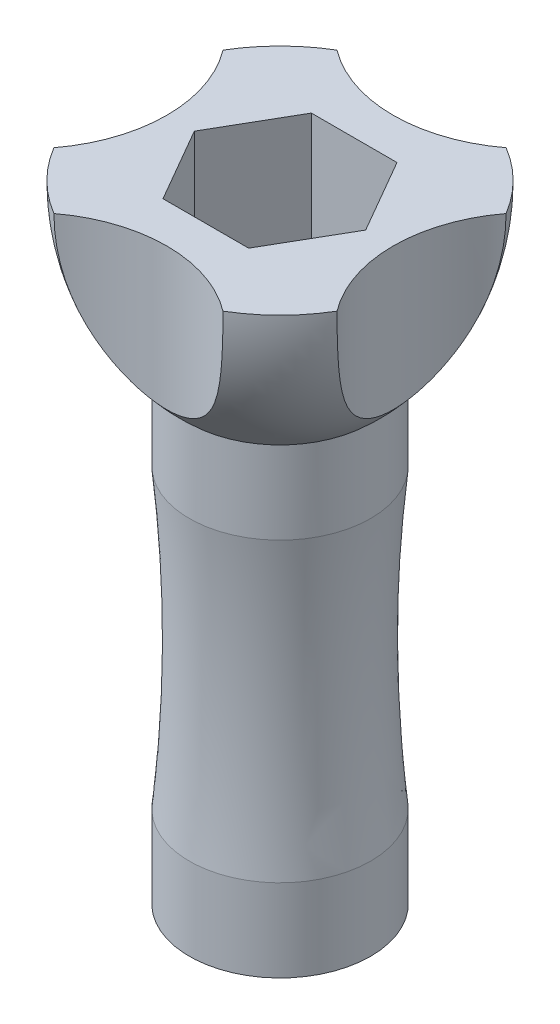
ISO-10303-21;
HEADER;
FILE_DESCRIPTION(('STEP AP214'),'2;1');
FILE_NAME('part.step','',(''),(''),'','','');
FILE_SCHEMA(('AUTOMOTIVE_DESIGN { 1 0 10303 214 1 1 1 1 }'));
ENDSEC;
DATA;
#1=APPLICATION_CONTEXT('core data for automotive mechanical design processes');
#2=APPLICATION_PROTOCOL_DEFINITION('international standard','automotive_design',2000,#1);
#3=PRODUCT_CONTEXT('',#1,'mechanical');
#4=PRODUCT('Part','Part','',(#3));
#5=PRODUCT_RELATED_PRODUCT_CATEGORY('part','',(#4));
#6=PRODUCT_DEFINITION_FORMATION('','',#4);
#7=PRODUCT_DEFINITION_CONTEXT('part definition',#1,'design');
#8=PRODUCT_DEFINITION('design','',#6,#7);
#9=PRODUCT_DEFINITION_SHAPE('','',#8);
#10=(LENGTH_UNIT() NAMED_UNIT(*) SI_UNIT(.MILLI.,.METRE.));
#11=(NAMED_UNIT(*) PLANE_ANGLE_UNIT() SI_UNIT($,.RADIAN.));
#12=(NAMED_UNIT(*) SI_UNIT($,.STERADIAN.) SOLID_ANGLE_UNIT());
#13=UNCERTAINTY_MEASURE_WITH_UNIT(LENGTH_MEASURE(1.E-05),#10,'distance_accuracy_value','');
#14=(GEOMETRIC_REPRESENTATION_CONTEXT(3) GLOBAL_UNCERTAINTY_ASSIGNED_CONTEXT((#13)) GLOBAL_UNIT_ASSIGNED_CONTEXT((#10,
#11,#12)) REPRESENTATION_CONTEXT('',''));
#15=CARTESIAN_POINT('',(0.,0.,0.));
#16=DIRECTION('',(0.,0.,1.));
#17=DIRECTION('',(1.,0.,0.));
#18=AXIS2_PLACEMENT_3D('',#15,#16,#17);
#19=CARTESIAN_POINT('',(0.,81.0055570515781,0.));
#20=DIRECTION('',(0.,1.,0.));
#21=DIRECTION('',(-1.,0.,0.));
#22=AXIS2_PLACEMENT_3D('',#19,#20,#21);
#23=PLANE('',#22);
#24=DIRECTION('',(-1.,0.,0.));
#25=VECTOR('',#24,1.);
#26=CARTESIAN_POINT('',(2.5980762113533,81.0055570515781,-4.50000000000001));
#27=LINE('',#26,#25);
#28=CARTESIAN_POINT('',(2.5980762113533,81.0055570515781,-4.50000000000001));
#29=VERTEX_POINT('',#28);
#30=CARTESIAN_POINT('',(-2.59807621135333,81.0055570515781,-4.49999999999999));
#31=VERTEX_POINT('',#30);
#32=EDGE_CURVE('E53',#29,#31,#27,.T.);
#33=ORIENTED_EDGE('',*,*,#32,.F.);
#34=DIRECTION('',(-0.500000000000004,0.,-0.866025403784436));
#35=VECTOR('',#34,1.);
#36=CARTESIAN_POINT('',(5.19615242270663,81.0055570515781,0.));
#37=LINE('',#36,#35);
#38=CARTESIAN_POINT('',(5.19615242270663,81.0055570515781,0.));
#39=VERTEX_POINT('',#38);
#40=EDGE_CURVE('E135',#39,#29,#37,.T.);
#41=ORIENTED_EDGE('',*,*,#40,.F.);
#42=DIRECTION('',(0.499999999999996,0.,-0.866025403784441));
#43=VECTOR('',#42,1.);
#44=CARTESIAN_POINT('',(2.59807621135333,81.0055570515781,4.49999999999999));
#45=LINE('',#44,#43);
#46=CARTESIAN_POINT('',(2.59807621135333,81.0055570515781,4.49999999999999));
#47=VERTEX_POINT('',#46);
#48=EDGE_CURVE('E138',#47,#39,#45,.T.);
#49=ORIENTED_EDGE('',*,*,#48,.F.);
#50=DIRECTION('',(1.,0.,0.));
#51=VECTOR('',#50,1.);
#52=CARTESIAN_POINT('',(-2.5980762113533,81.0055570515781,4.50000000000001));
#53=LINE('',#52,#51);
#54=CARTESIAN_POINT('',(-2.5980762113533,81.0055570515781,4.50000000000001));
#55=VERTEX_POINT('',#54);
#56=EDGE_CURVE('E157',#55,#47,#53,.T.);
#57=ORIENTED_EDGE('',*,*,#56,.F.);
#58=DIRECTION('',(0.500000000000004,0.,0.866025403784436));
#59=VECTOR('',#58,1.);
#60=CARTESIAN_POINT('',(-5.19615242270663,81.0055570515781,0.));
#61=LINE('',#60,#59);
#62=CARTESIAN_POINT('',(-5.19615242270663,81.0055570515781,0.));
#63=VERTEX_POINT('',#62);
#64=EDGE_CURVE('E154',#63,#55,#61,.T.);
#65=ORIENTED_EDGE('',*,*,#64,.F.);
#66=DIRECTION('',(-0.499999999999996,0.,0.866025403784441));
#67=VECTOR('',#66,1.);
#68=CARTESIAN_POINT('',(-2.59807621135334,81.0055570515781,-4.49999999999999));
#69=LINE('',#68,#67);
#70=EDGE_CURVE('E152',#31,#63,#69,.T.);
#71=ORIENTED_EDGE('',*,*,#70,.F.);
#72=EDGE_LOOP('',(#33,#41,#49,#57,#65,#71));
#73=FACE_BOUND('',#72,.T.);
#74=CARTESIAN_POINT('',(15.3642734399295,81.0055570515781,-1.60932222001191E-13));
#75=DIRECTION('',(0.,1.,0.));
#76=DIRECTION('',(0.,0.,-1.));
#77=AXIS2_PLACEMENT_3D('',#74,#75,#76);
#78=CIRCLE('',#77,8.5);
#79=CARTESIAN_POINT('',(8.58520578172331,81.0055570515781,-5.12779111172292));
#80=VERTEX_POINT('',#79);
#81=CARTESIAN_POINT('',(8.58520578172342,81.0055570515781,5.12779111172274));
#82=VERTEX_POINT('',#81);
#83=EDGE_CURVE('E59',#80,#82,#78,.T.);
#84=ORIENTED_EDGE('',*,*,#83,.F.);
#85=CARTESIAN_POINT('',(0.,81.0055570515781,0.));
#86=DIRECTION('',(0.,1.,0.));
#87=DIRECTION('',(-1.,0.,0.));
#88=AXIS2_PLACEMENT_3D('',#85,#86,#87);
#89=CIRCLE('',#88,10.);
#90=CARTESIAN_POINT('',(5.12779111172283,81.0055570515781,-8.58520578172337));
#91=VERTEX_POINT('',#90);
#92=EDGE_CURVE('E259',#80,#91,#89,.T.);
#93=ORIENTED_EDGE('',*,*,#92,.T.);
#94=CARTESIAN_POINT('',(0.,81.0055570515781,-15.3642734399295));
#95=DIRECTION('',(0.,1.,0.));
#96=DIRECTION('',(-1.,0.,0.));
#97=AXIS2_PLACEMENT_3D('',#94,#95,#96);
#98=CIRCLE('',#97,8.5);
#99=CARTESIAN_POINT('',(-5.12779111172283,81.0055570515781,-8.58520578172337));
#100=VERTEX_POINT('',#99);
#101=EDGE_CURVE('E176',#100,#91,#98,.T.);
#102=ORIENTED_EDGE('',*,*,#101,.F.);
#103=CARTESIAN_POINT('',(-8.58520578172339,81.0055570515781,-5.1277911117228));
#104=VERTEX_POINT('',#103);
#105=EDGE_CURVE('E267',#100,#104,#89,.T.);
#106=ORIENTED_EDGE('',*,*,#105,.T.);
#107=CARTESIAN_POINT('',(-15.3642734399295,81.0055570515781,0.));
#108=DIRECTION('',(0.,1.,0.));
#109=DIRECTION('',(0.,0.,1.));
#110=AXIS2_PLACEMENT_3D('',#107,#108,#109);
#111=CIRCLE('',#110,8.5);
#112=CARTESIAN_POINT('',(-8.58520578172335,81.0055570515781,5.12779111172286));
#113=VERTEX_POINT('',#112);
#114=EDGE_CURVE('E174',#113,#104,#111,.T.);
#115=ORIENTED_EDGE('',*,*,#114,.F.);
#116=CARTESIAN_POINT('',(-5.12779111172283,81.0055570515781,8.58520578172337));
#117=VERTEX_POINT('',#116);
#118=EDGE_CURVE('E268',#113,#117,#89,.T.);
#119=ORIENTED_EDGE('',*,*,#118,.T.);
#120=CARTESIAN_POINT('',(0.,81.0055570515781,15.3642734399295));
#121=DIRECTION('',(0.,1.,0.));
#122=DIRECTION('',(1.,0.,0.));
#123=AXIS2_PLACEMENT_3D('',#120,#121,#122);
#124=CIRCLE('',#123,8.5);
#125=CARTESIAN_POINT('',(5.12779111172283,81.0055570515781,8.58520578172337));
#126=VERTEX_POINT('',#125);
#127=EDGE_CURVE('E172',#126,#117,#124,.T.);
#128=ORIENTED_EDGE('',*,*,#127,.F.);
#129=EDGE_CURVE('E262',#126,#82,#89,.T.);
#130=ORIENTED_EDGE('',*,*,#129,.T.);
#131=EDGE_LOOP('',(#84,#93,#102,#106,#115,#119,#128,#130));
#132=FACE_BOUND('',#131,.T.);
#133=ADVANCED_FACE('F34',(#73,#132),#23,.T.);
#134=CARTESIAN_POINT('',(0.,81.0055570515781,0.));
#135=DIRECTION('',(0.,1.,0.));
#136=DIRECTION('',(-1.,0.,0.));
#137=AXIS2_PLACEMENT_3D('',#134,#135,#136);
#138=DEGENERATE_TOROIDAL_SURFACE('',#137,3.36111111111111,13.3611111111111,.F.);
#139=CARTESIAN_POINT('',(8.58520578074916,81.0057570515781,5.12779111043474));
#140=CARTESIAN_POINT('',(8.58521510235949,80.8258874002957,5.1277844100921));
#141=CARTESIAN_POINT('',(8.58284540719682,80.6460181022198,5.12467012819343));
#142=CARTESIAN_POINT('',(8.57340323176649,80.2866124661946,5.1121614356591));
#143=CARTESIAN_POINT('',(8.5663305058715,80.1070761461271,5.10276669701104));
#144=CARTESIAN_POINT('',(8.54752250671016,79.7484011192916,5.07761202233893));
#145=CARTESIAN_POINT('',(8.53577979792645,79.5692635069664,5.06184193485922));
#146=CARTESIAN_POINT('',(8.50775011829168,79.2120524184934,5.02380681499541));
#147=CARTESIAN_POINT('',(8.49146322599246,79.0339789240054,5.00154189488221));
#148=CARTESIAN_POINT('',(8.43562888599376,78.4983060877408,4.92423248457801));
#149=CARTESIAN_POINT('',(8.38929798991118,78.1428107469501,4.85891400251113));
#150=CARTESIAN_POINT('',(8.2805822745697,77.4412363668623,4.6990090435988));
#151=CARTESIAN_POINT('',(8.21821190013479,77.0951491632736,4.60444888576899));
#152=CARTESIAN_POINT('',(8.10774916456528,76.5515205756915,4.42706932263151));
#153=CARTESIAN_POINT('',(8.06386403265072,76.3497160336694,4.35457405601448));
#154=CARTESIAN_POINT('',(7.97212280976563,75.9519847065445,4.19695677456097));
#155=CARTESIAN_POINT('',(7.92426670841742,75.7560579368044,4.11183472672536));
#156=CARTESIAN_POINT('',(7.82572248150285,75.3720628144471,3.92824049763953));
#157=CARTESIAN_POINT('',(7.77504383841834,75.183971468735,3.82981159828957));
#158=CARTESIAN_POINT('',(7.6719473718007,74.8168002845552,3.61827918614909));
#159=CARTESIAN_POINT('',(7.61953021370208,74.6377170627054,3.50518124092443));
#160=CARTESIAN_POINT('',(7.49643791079024,74.2313832891448,3.22159201431549));
#161=CARTESIAN_POINT('',(7.42563809388911,74.0085577916968,3.04468773087888));
#162=CARTESIAN_POINT('',(7.28824337924347,73.5908227026285,2.6588631061338));
#163=CARTESIAN_POINT('',(7.22164325771497,73.3958780326295,2.44998369223612));
#164=CARTESIAN_POINT('',(7.11596840906974,73.0938083902993,2.06016067067646));
#165=CARTESIAN_POINT('',(7.07435387075474,72.9772608889479,1.88726448434432));
#166=CARTESIAN_POINT('',(6.9999833051339,72.7715021565778,1.52408416151124));
#167=CARTESIAN_POINT('',(6.96721420030134,72.6822505436937,1.33382625691851));
#168=CARTESIAN_POINT('',(6.91850029073493,72.5504922875337,0.972720969629719));
#169=CARTESIAN_POINT('',(6.90063704068949,72.5026029520231,0.804115212035829));
#170=CARTESIAN_POINT('',(6.87502650710229,72.4341124908896,0.460695784841164));
#171=CARTESIAN_POINT('',(6.86727136946848,72.4134901783706,0.285887043639818));
#172=CARTESIAN_POINT('',(6.86270679152793,72.4013401617101,-0.0652932285348966));
#173=CARTESIAN_POINT('',(6.86592182398371,72.4098775083263,-0.241667377026025));
#174=CARTESIAN_POINT('',(6.882989166515,72.4553948650794,-0.590177026018225));
#175=CARTESIAN_POINT('',(6.89684672333955,72.4923889043387,-0.762310392607131));
#176=CARTESIAN_POINT('',(6.93337816584581,72.5906550057985,-1.09422530084855));
#177=CARTESIAN_POINT('',(6.95585308928579,72.6513797296783,-1.25419440047924));
#178=CARTESIAN_POINT('',(7.00782516932235,72.7932727194891,-1.56346067972205));
#179=CARTESIAN_POINT('',(7.03732527370789,72.8744495680297,-1.71275334518184));
#180=CARTESIAN_POINT('',(7.12133934515685,73.1087888323686,-2.08820154643023));
#181=CARTESIAN_POINT('',(7.18005934266116,73.275470243877,-2.30497420051247));
#182=CARTESIAN_POINT('',(7.30452558876643,73.6399415271167,-2.70837812142575));
#183=CARTESIAN_POINT('',(7.37029123711913,73.8378180366124,-2.89492241882454));
#184=CARTESIAN_POINT('',(7.48871434324869,74.2085132791403,-3.20093343169055));
#185=CARTESIAN_POINT('',(7.5409775887762,74.3768975623972,-3.32603421391277));
#186=CARTESIAN_POINT('',(7.64500494455999,74.724328644567,-3.56081510640736));
#187=CARTESIAN_POINT('',(7.69676876976349,74.903381157415,-3.67048684520418));
#188=CARTESIAN_POINT('',(7.79843313018467,75.2702114230251,-3.87571754713384));
#189=CARTESIAN_POINT('',(7.84833083575132,75.4580015285221,-3.97125567966265));
#190=CARTESIAN_POINT('',(7.94506417028657,75.8405014067315,-4.14916539930637));
#191=CARTESIAN_POINT('',(7.9918989360158,76.0352131065192,-4.23153328397305));
#192=CARTESIAN_POINT('',(8.10168008897518,76.5188980093283,-4.41828367024131));
#193=CARTESIAN_POINT('',(8.16242880622171,76.8109720652385,-4.51596560718152));
#194=CARTESIAN_POINT('',(8.27330577723037,77.40391361987,-4.68813764283413));
#195=CARTESIAN_POINT('',(8.32342853420672,77.7047855786005,-4.76261574756427));
#196=CARTESIAN_POINT('',(8.41137002805972,78.3125375746025,-4.89010449255737));
#197=CARTESIAN_POINT('',(8.44919808240863,78.6194128743999,-4.9431313969854));
#198=CARTESIAN_POINT('',(8.51144511389522,79.2371491092861,-5.02907137675292));
#199=CARTESIAN_POINT('',(8.53587119701079,79.5480078426291,-5.0619951122189));
#200=CARTESIAN_POINT('',(8.56388642153772,80.0505883227128,-5.09951324246309));
#201=CARTESIAN_POINT('',(8.57188448344948,80.2416462656977,-5.11014500176714));
#202=CARTESIAN_POINT('',(8.58254259390755,80.6237169747329,-5.12427104569803));
#203=CARTESIAN_POINT('',(8.58521535903792,80.8147287566903,-5.12778233406707));
#204=CARTESIAN_POINT('',(8.58520578074905,81.0057570515781,-5.12779111043492));
#205=B_SPLINE_CURVE_WITH_KNOTS('',3,(#139,#140,#141,#142,#143,#144,#145,#146,#147,#148,#149,
#150,#151,#152,#153,#154,#155,#156,#157,#158,#159,#160,#161,#162,#163,#164,#165,#166,#167,#168,
#169,#170,#171,#172,#173,#174,#175,#176,#177,#178,#179,#180,#181,#182,#183,#184,#185,#186,#187,
#188,#189,#190,#191,#192,#193,#194,#195,#196,#197,#198,#199,#200,#201,#202,#203,#204),
.UNSPECIFIED.,.F.,.F.,(4,2,2,2,2,2,2,2,2,2,2,2,2,2,2,2,2,2,2,2,2,2,2,2,2,2,2,2,2,2,2,2,4),(0.,
0.53956500657715,1.07915819547398,1.61961398311804,2.16006042889451,3.2516230957294,
4.34220614540108,4.9984239672419,5.65464350408923,6.30877778922379,6.96266452340408,
7.83975749839001,8.71573706001084,9.35149585268555,9.9863094949294,10.5126048696457,
11.0384910639751,11.5655511958403,12.0928713345148,12.6086857848282,13.1247170551278,
13.9590107504667,14.7956637201667,15.4433531594585,16.0913926771979,16.7403779813031,
17.3895454099902,18.3299349430704,19.2708097569301,20.210969862351,21.1506309942418,
21.7250042627116,22.2980043002763),.UNSPECIFIED.);
#206=EDGE_CURVE('E11',#82,#80,#205,.T.);
#207=ORIENTED_EDGE('',*,*,#206,.F.);
#208=ORIENTED_EDGE('',*,*,#129,.F.);
#209=CARTESIAN_POINT('',(-5.12779111043483,81.0057570515781,8.58520578074911));
#210=CARTESIAN_POINT('',(-5.12778441009219,80.8258874002957,8.58521510235944));
#211=CARTESIAN_POINT('',(-5.12467012819352,80.6460181022198,8.58284540719677));
#212=CARTESIAN_POINT('',(-5.11216143565919,80.2866124661946,8.57340323176644));
#213=CARTESIAN_POINT('',(-5.10276669701113,80.1070761461271,8.56633050587145));
#214=CARTESIAN_POINT('',(-5.07761202233902,79.7484011192916,8.54752250671011));
#215=CARTESIAN_POINT('',(-5.06184193485931,79.5692635069664,8.53577979792639));
#216=CARTESIAN_POINT('',(-5.0238068149955,79.2120524184934,8.50775011829163));
#217=CARTESIAN_POINT('',(-5.0015418948823,79.0339789240054,8.49146322599241));
#218=CARTESIAN_POINT('',(-4.92423248457809,78.4983060877408,8.43562888599371));
#219=CARTESIAN_POINT('',(-4.85891400251122,78.1428107469501,8.38929798991112));
#220=CARTESIAN_POINT('',(-4.69900904359889,77.4412363668623,8.28058227456965));
#221=CARTESIAN_POINT('',(-4.60444888576907,77.0951491632736,8.21821190013474));
#222=CARTESIAN_POINT('',(-4.4270693226316,76.5515205756915,8.10774916456523));
#223=CARTESIAN_POINT('',(-4.35457405601456,76.3497160336694,8.06386403265067));
#224=CARTESIAN_POINT('',(-4.19695677456106,75.9519847065445,7.97212280976559));
#225=CARTESIAN_POINT('',(-4.11183472672544,75.7560579368044,7.92426670841738));
#226=CARTESIAN_POINT('',(-3.92824049763962,75.3720628144471,7.82572248150281));
#227=CARTESIAN_POINT('',(-3.82981159828966,75.183971468735,7.7750438384183));
#228=CARTESIAN_POINT('',(-3.61827918614919,74.8168002845552,7.67194737180067));
#229=CARTESIAN_POINT('',(-3.50518124092452,74.6377170627054,7.61953021370205));
#230=CARTESIAN_POINT('',(-3.22159201431558,74.2313832891448,7.49643791079021));
#231=CARTESIAN_POINT('',(-3.04468773087896,74.0085577916968,7.42563809388908));
#232=CARTESIAN_POINT('',(-2.65886310613388,73.5908227026285,7.28824337924344));
#233=CARTESIAN_POINT('',(-2.4499836922362,73.3958780326295,7.22164325771495));
#234=CARTESIAN_POINT('',(-2.06016067067654,73.0938083902993,7.11596840906972));
#235=CARTESIAN_POINT('',(-1.8872644843444,72.9772608889479,7.07435387075472));
#236=CARTESIAN_POINT('',(-1.52408416151133,72.7715021565778,6.99998330513389));
#237=CARTESIAN_POINT('',(-1.3338262569186,72.6822505436937,6.96721420030132));
#238=CARTESIAN_POINT('',(-0.972720969629809,72.5504922875337,6.91850029073492));
#239=CARTESIAN_POINT('',(-0.804115212035921,72.5026029520231,6.90063704068949));
#240=CARTESIAN_POINT('',(-0.460695784841255,72.4341124908896,6.87502650710228));
#241=CARTESIAN_POINT('',(-0.285887043639906,72.4134901783706,6.86727136946847));
#242=CARTESIAN_POINT('',(0.0652932285348104,72.4013401617101,6.86270679152793));
#243=CARTESIAN_POINT('',(0.241667377025939,72.4098775083263,6.86592182398372));
#244=CARTESIAN_POINT('',(0.59017702601814,72.4553948650794,6.88298916651501));
#245=CARTESIAN_POINT('',(0.762310392607046,72.4923889043387,6.89684672333955));
#246=CARTESIAN_POINT('',(1.09422530084847,72.5906550057985,6.93337816584582));
#247=CARTESIAN_POINT('',(1.25419440047916,72.6513797296783,6.9558530892858));
#248=CARTESIAN_POINT('',(1.56346067972197,72.7932727194891,7.00782516932236));
#249=CARTESIAN_POINT('',(1.71275334518176,72.8744495680297,7.03732527370791));
#250=CARTESIAN_POINT('',(2.08820154643015,73.1087888323686,7.12133934515687));
#251=CARTESIAN_POINT('',(2.30497420051238,73.275470243877,7.18005934266118));
#252=CARTESIAN_POINT('',(2.70837812142566,73.6399415271167,7.30452558876645));
#253=CARTESIAN_POINT('',(2.89492241882445,73.8378180366124,7.37029123711915));
#254=CARTESIAN_POINT('',(3.20093343169046,74.2085132791402,7.48871434324872));
#255=CARTESIAN_POINT('',(3.32603421391268,74.3768975623972,7.54097758877623));
#256=CARTESIAN_POINT('',(3.56081510640727,74.724328644567,7.64500494456002));
#257=CARTESIAN_POINT('',(3.67048684520409,74.903381157415,7.69676876976352));
#258=CARTESIAN_POINT('',(3.87571754713375,75.2702114230251,7.79843313018471));
#259=CARTESIAN_POINT('',(3.97125567966256,75.4580015285221,7.84833083575136));
#260=CARTESIAN_POINT('',(4.14916539930628,75.8405014067314,7.94506417028661));
#261=CARTESIAN_POINT('',(4.23153328397295,76.0352131065192,7.99189893601584));
#262=CARTESIAN_POINT('',(4.41828367024122,76.5188980093283,8.10168008897522));
#263=CARTESIAN_POINT('',(4.51596560718143,76.8109720652385,8.16242880622175));
#264=CARTESIAN_POINT('',(4.68813764283403,77.4039136198699,8.27330577723042));
#265=CARTESIAN_POINT('',(4.76261574756417,77.7047855786004,8.32342853420676));
#266=CARTESIAN_POINT('',(4.89010449255727,78.3125375746024,8.41137002805977));
#267=CARTESIAN_POINT('',(4.9431313969853,78.6194128743998,8.44919808240867));
#268=CARTESIAN_POINT('',(5.02907137675283,79.2371491092861,8.51144511389527));
#269=CARTESIAN_POINT('',(5.0619951122188,79.5480078426291,8.53587119701084));
#270=CARTESIAN_POINT('',(5.099513242463,80.0505883227128,8.56388642153777));
#271=CARTESIAN_POINT('',(5.11014500176704,80.2416462656977,8.57188448344953));
#272=CARTESIAN_POINT('',(5.12427104569794,80.6237169747329,8.5825425939076));
#273=CARTESIAN_POINT('',(5.12778233406698,80.8147287566903,8.58521535903797));
#274=CARTESIAN_POINT('',(5.12779111043483,81.0057570515781,8.5852057807491));
#275=B_SPLINE_CURVE_WITH_KNOTS('',3,(#209,#210,#211,#212,#213,#214,#215,#216,#217,#218,#219,
#220,#221,#222,#223,#224,#225,#226,#227,#228,#229,#230,#231,#232,#233,#234,#235,#236,#237,#238,
#239,#240,#241,#242,#243,#244,#245,#246,#247,#248,#249,#250,#251,#252,#253,#254,#255,#256,#257,
#258,#259,#260,#261,#262,#263,#264,#265,#266,#267,#268,#269,#270,#271,#272,#273,#274),
.UNSPECIFIED.,.F.,.F.,(4,2,2,2,2,2,2,2,2,2,2,2,2,2,2,2,2,2,2,2,2,2,2,2,2,2,2,2,2,2,2,2,4),(0.,
0.53956500657715,1.07915819547398,1.61961398311804,2.16006042889451,3.25162309572941,
4.34220614540108,4.9984239672419,5.65464350408923,6.30877778922376,6.96266452340406,
7.83975749838999,8.71573706001082,9.35149585268553,9.98630949492938,10.5126048696457,
11.038491063975,11.5655511958402,12.0928713345147,12.6086857848282,13.1247170551278,
13.9590107504666,14.7956637201667,15.4433531594584,16.0913926771978,16.7403779813031,
17.3895454099902,18.3299349430704,19.27080975693,20.2109698623509,21.1506309942417,
21.7250042627116,22.2980043002763),.UNSPECIFIED.);
#276=EDGE_CURVE('E46',#117,#126,#275,.T.);
#277=ORIENTED_EDGE('',*,*,#276,.F.);
#278=ORIENTED_EDGE('',*,*,#118,.F.);
#279=CARTESIAN_POINT('',(-8.58520578074912,81.0057570515781,-5.1277911104348));
#280=CARTESIAN_POINT('',(-8.58521510235945,80.8258874002957,-5.12778441009216));
#281=CARTESIAN_POINT('',(-8.58284540719679,80.6460181022198,-5.12467012819349));
#282=CARTESIAN_POINT('',(-8.57340323176645,80.2866124661946,-5.11216143565916));
#283=CARTESIAN_POINT('',(-8.56633050587147,80.1070761461271,-5.1027666970111));
#284=CARTESIAN_POINT('',(-8.54752250671013,79.7484011192916,-5.07761202233899));
#285=CARTESIAN_POINT('',(-8.53577979792641,79.5692635069664,-5.06184193485928));
#286=CARTESIAN_POINT('',(-8.50775011829165,79.2120524184934,-5.02380681499547));
#287=CARTESIAN_POINT('',(-8.49146322599243,79.0339789240054,-5.00154189488228));
#288=CARTESIAN_POINT('',(-8.43562888599372,78.4983060877408,-4.92423248457806));
#289=CARTESIAN_POINT('',(-8.38929798991114,78.1428107469501,-4.85891400251119));
#290=CARTESIAN_POINT('',(-8.28058227456967,77.4412363668623,-4.69900904359886));
#291=CARTESIAN_POINT('',(-8.21821190013475,77.0951491632736,-4.60444888576905));
#292=CARTESIAN_POINT('',(-8.10774916456525,76.5515205756915,-4.42706932263157));
#293=CARTESIAN_POINT('',(-8.06386403265069,76.3497160336694,-4.35457405601453));
#294=CARTESIAN_POINT('',(-7.97212280976561,75.9519847065445,-4.19695677456103));
#295=CARTESIAN_POINT('',(-7.92426670841739,75.7560579368044,-4.11183472672541));
#296=CARTESIAN_POINT('',(-7.82572248150282,75.3720628144471,-3.92824049763959));
#297=CARTESIAN_POINT('',(-7.77504383841831,75.183971468735,-3.82981159828963));
#298=CARTESIAN_POINT('',(-7.67194737180068,74.8168002845552,-3.61827918614916));
#299=CARTESIAN_POINT('',(-7.61953021370206,74.6377170627054,-3.50518124092449));
#300=CARTESIAN_POINT('',(-7.49643791079022,74.2313832891448,-3.22159201431555));
#301=CARTESIAN_POINT('',(-7.42563809388909,74.0085577916968,-3.04468773087894));
#302=CARTESIAN_POINT('',(-7.28824337924345,73.5908227026285,-2.65886310613385));
#303=CARTESIAN_POINT('',(-7.22164325771496,73.3958780326295,-2.44998369223617));
#304=CARTESIAN_POINT('',(-7.11596840906973,73.0938083902993,-2.06016067067652));
#305=CARTESIAN_POINT('',(-7.07435387075473,72.9772608889479,-1.88726448434438));
#306=CARTESIAN_POINT('',(-6.99998330513389,72.7715021565778,-1.5240841615113));
#307=CARTESIAN_POINT('',(-6.96721420030133,72.6822505436937,-1.33382625691858));
#308=CARTESIAN_POINT('',(-6.91850029073492,72.5504922875337,-0.972720969629784));
#309=CARTESIAN_POINT('',(-6.90063704068949,72.5026029520231,-0.804115212035896));
#310=CARTESIAN_POINT('',(-6.87502650710228,72.4341124908896,-0.46069578484123));
#311=CARTESIAN_POINT('',(-6.86727136946848,72.4134901783706,-0.285887043639881));
#312=CARTESIAN_POINT('',(-6.86270679152793,72.4013401617101,0.0652932285348364));
#313=CARTESIAN_POINT('',(-6.86592182398372,72.4098775083263,0.241667377025965));
#314=CARTESIAN_POINT('',(-6.88298916651501,72.4553948650794,0.590177026018167));
#315=CARTESIAN_POINT('',(-6.89684672333955,72.4923889043387,0.762310392607074));
#316=CARTESIAN_POINT('',(-6.93337816584581,72.5906550057985,1.0942253008485));
#317=CARTESIAN_POINT('',(-6.9558530892858,72.6513797296783,1.25419440047919));
#318=CARTESIAN_POINT('',(-7.00782516932236,72.7932727194891,1.563460679722));
#319=CARTESIAN_POINT('',(-7.0373252737079,72.8744495680297,1.71275334518178));
#320=CARTESIAN_POINT('',(-7.12133934515686,73.1087888323686,2.08820154643018));
#321=CARTESIAN_POINT('',(-7.18005934266117,73.275470243877,2.30497420051241));
#322=CARTESIAN_POINT('',(-7.30452558876644,73.6399415271167,2.70837812142569));
#323=CARTESIAN_POINT('',(-7.37029123711914,73.8378180366124,2.89492241882448));
#324=CARTESIAN_POINT('',(-7.48871434324871,74.2085132791403,3.20093343169049));
#325=CARTESIAN_POINT('',(-7.54097758877622,74.3768975623972,3.32603421391272));
#326=CARTESIAN_POINT('',(-7.64500494456002,74.724328644567,3.56081510640731));
#327=CARTESIAN_POINT('',(-7.69676876976351,74.903381157415,3.67048684520413));
#328=CARTESIAN_POINT('',(-7.7984331301847,75.2702114230251,3.87571754713378));
#329=CARTESIAN_POINT('',(-7.84833083575135,75.4580015285221,3.9712556796626));
#330=CARTESIAN_POINT('',(-7.9450641702866,75.8405014067315,4.14916539930632));
#331=CARTESIAN_POINT('',(-7.99189893601583,76.0352131065192,4.23153328397299));
#332=CARTESIAN_POINT('',(-8.10168008897521,76.5188980093283,4.41828367024125));
#333=CARTESIAN_POINT('',(-8.16242880622174,76.8109720652385,4.51596560718146));
#334=CARTESIAN_POINT('',(-8.27330577723041,77.40391361987,4.68813764283406));
#335=CARTESIAN_POINT('',(-8.32342853420675,77.7047855786005,4.76261574756421));
#336=CARTESIAN_POINT('',(-8.41137002805976,78.3125375746025,4.89010449255731));
#337=CARTESIAN_POINT('',(-8.44919808240866,78.6194128743998,4.94313139698534));
#338=CARTESIAN_POINT('',(-8.51144511389525,79.2371491092861,5.02907137675286));
#339=CARTESIAN_POINT('',(-8.53587119701082,79.5480078426291,5.06199511221884));
#340=CARTESIAN_POINT('',(-8.56388642153775,80.0505883227128,5.09951324246303));
#341=CARTESIAN_POINT('',(-8.57188448344951,80.2416462656977,5.11014500176708));
#342=CARTESIAN_POINT('',(-8.58254259390758,80.6237169747329,5.12427104569797));
#343=CARTESIAN_POINT('',(-8.58521535903795,80.8147287566903,5.12778233406701));
#344=CARTESIAN_POINT('',(-8.58520578074909,81.0057570515781,5.12779111043486));
#345=B_SPLINE_CURVE_WITH_KNOTS('',3,(#279,#280,#281,#282,#283,#284,#285,#286,#287,#288,#289,
#290,#291,#292,#293,#294,#295,#296,#297,#298,#299,#300,#301,#302,#303,#304,#305,#306,#307,#308,
#309,#310,#311,#312,#313,#314,#315,#316,#317,#318,#319,#320,#321,#322,#323,#324,#325,#326,#327,
#328,#329,#330,#331,#332,#333,#334,#335,#336,#337,#338,#339,#340,#341,#342,#343,#344),
.UNSPECIFIED.,.F.,.F.,(4,2,2,2,2,2,2,2,2,2,2,2,2,2,2,2,2,2,2,2,2,2,2,2,2,2,2,2,2,2,2,2,4),(0.,
0.53956500657715,1.07915819547398,1.61961398311804,2.16006042889451,3.2516230957294,
4.34220614540108,4.9984239672419,5.65464350408923,6.30877778922376,6.96266452340406,
7.83975749838999,8.71573706001083,9.35149585268553,9.98630949492938,10.5126048696457,
11.038491063975,11.5655511958402,12.0928713345148,12.6086857848282,13.1247170551278,
13.9590107504666,14.7956637201667,15.4433531594585,16.0913926771979,16.7403779813031,
17.3895454099902,18.3299349430704,19.2708097569301,20.2109698623509,21.1506309942417,
21.7250042627116,22.2980043002763),.UNSPECIFIED.);
#346=EDGE_CURVE('E215',#104,#113,#345,.T.);
#347=ORIENTED_EDGE('',*,*,#346,.F.);
#348=ORIENTED_EDGE('',*,*,#105,.F.);
#349=CARTESIAN_POINT('',(5.12779111043483,81.0057570515781,-8.58520578074911));
#350=CARTESIAN_POINT('',(5.12778441009219,80.8258874002957,-8.58521510235944));
#351=CARTESIAN_POINT('',(5.12467012819352,80.6460181022198,-8.58284540719677));
#352=CARTESIAN_POINT('',(5.11216143565919,80.2866124661946,-8.57340323176644));
#353=CARTESIAN_POINT('',(5.10276669701113,80.1070761461271,-8.56633050587145));
#354=CARTESIAN_POINT('',(5.07761202233902,79.7484011192916,-8.54752250671011));
#355=CARTESIAN_POINT('',(5.06184193485931,79.5692635069664,-8.53577979792639));
#356=CARTESIAN_POINT('',(5.0238068149955,79.2120524184934,-8.50775011829163));
#357=CARTESIAN_POINT('',(5.0015418948823,79.0339789240054,-8.49146322599241));
#358=CARTESIAN_POINT('',(4.92423248457809,78.4983060877408,-8.43562888599371));
#359=CARTESIAN_POINT('',(4.85891400251122,78.1428107469501,-8.38929798991112));
#360=CARTESIAN_POINT('',(4.69900904359889,77.4412363668623,-8.28058227456965));
#361=CARTESIAN_POINT('',(4.60444888576907,77.0951491632736,-8.21821190013474));
#362=CARTESIAN_POINT('',(4.4270693226316,76.5515205756915,-8.10774916456523));
#363=CARTESIAN_POINT('',(4.35457405601456,76.3497160336694,-8.06386403265067));
#364=CARTESIAN_POINT('',(4.19695677456106,75.9519847065445,-7.97212280976559));
#365=CARTESIAN_POINT('',(4.11183472672544,75.7560579368044,-7.92426670841738));
#366=CARTESIAN_POINT('',(3.92824049763962,75.3720628144471,-7.82572248150281));
#367=CARTESIAN_POINT('',(3.82981159828966,75.183971468735,-7.7750438384183));
#368=CARTESIAN_POINT('',(3.61827918614919,74.8168002845552,-7.67194737180067));
#369=CARTESIAN_POINT('',(3.50518124092452,74.6377170627054,-7.61953021370205));
#370=CARTESIAN_POINT('',(3.22159201431558,74.2313832891448,-7.49643791079021));
#371=CARTESIAN_POINT('',(3.04468773087896,74.0085577916968,-7.42563809388908));
#372=CARTESIAN_POINT('',(2.65886310613388,73.5908227026285,-7.28824337924344));
#373=CARTESIAN_POINT('',(2.4499836922362,73.3958780326295,-7.22164325771495));
#374=CARTESIAN_POINT('',(2.06016067067654,73.0938083902993,-7.11596840906972));
#375=CARTESIAN_POINT('',(1.8872644843444,72.9772608889479,-7.07435387075472));
#376=CARTESIAN_POINT('',(1.52408416151133,72.7715021565778,-6.99998330513389));
#377=CARTESIAN_POINT('',(1.3338262569186,72.6822505436937,-6.96721420030132));
#378=CARTESIAN_POINT('',(0.972720969629809,72.5504922875337,-6.91850029073492));
#379=CARTESIAN_POINT('',(0.804115212035921,72.5026029520231,-6.90063704068949));
#380=CARTESIAN_POINT('',(0.460695784841255,72.4341124908896,-6.87502650710228));
#381=CARTESIAN_POINT('',(0.285887043639906,72.4134901783706,-6.86727136946847));
#382=CARTESIAN_POINT('',(-0.0652932285348103,72.4013401617101,-6.86270679152793));
#383=CARTESIAN_POINT('',(-0.241667377025939,72.4098775083263,-6.86592182398372));
#384=CARTESIAN_POINT('',(-0.59017702601814,72.4553948650794,-6.88298916651501));
#385=CARTESIAN_POINT('',(-0.762310392607046,72.4923889043387,-6.89684672333955));
#386=CARTESIAN_POINT('',(-1.09422530084847,72.5906550057985,-6.93337816584582));
#387=CARTESIAN_POINT('',(-1.25419440047916,72.6513797296783,-6.9558530892858));
#388=CARTESIAN_POINT('',(-1.56346067972197,72.7932727194891,-7.00782516932236));
#389=CARTESIAN_POINT('',(-1.71275334518176,72.8744495680297,-7.03732527370791));
#390=CARTESIAN_POINT('',(-2.08820154643015,73.1087888323686,-7.12133934515687));
#391=CARTESIAN_POINT('',(-2.30497420051238,73.275470243877,-7.18005934266118));
#392=CARTESIAN_POINT('',(-2.70837812142566,73.6399415271167,-7.30452558876645));
#393=CARTESIAN_POINT('',(-2.89492241882445,73.8378180366124,-7.37029123711915));
#394=CARTESIAN_POINT('',(-3.20093343169046,74.2085132791402,-7.48871434324872));
#395=CARTESIAN_POINT('',(-3.32603421391268,74.3768975623972,-7.54097758877623));
#396=CARTESIAN_POINT('',(-3.56081510640727,74.724328644567,-7.64500494456002));
#397=CARTESIAN_POINT('',(-3.67048684520409,74.903381157415,-7.69676876976352));
#398=CARTESIAN_POINT('',(-3.87571754713375,75.2702114230251,-7.79843313018471));
#399=CARTESIAN_POINT('',(-3.97125567966256,75.4580015285221,-7.84833083575136));
#400=CARTESIAN_POINT('',(-4.14916539930628,75.8405014067314,-7.94506417028661));
#401=CARTESIAN_POINT('',(-4.23153328397295,76.0352131065192,-7.99189893601584));
#402=CARTESIAN_POINT('',(-4.41828367024122,76.5188980093283,-8.10168008897522));
#403=CARTESIAN_POINT('',(-4.51596560718143,76.8109720652385,-8.16242880622175));
#404=CARTESIAN_POINT('',(-4.68813764283403,77.4039136198699,-8.27330577723042));
#405=CARTESIAN_POINT('',(-4.76261574756417,77.7047855786004,-8.32342853420676));
#406=CARTESIAN_POINT('',(-4.89010449255727,78.3125375746024,-8.41137002805977));
#407=CARTESIAN_POINT('',(-4.9431313969853,78.6194128743998,-8.44919808240867));
#408=CARTESIAN_POINT('',(-5.02907137675283,79.2371491092861,-8.51144511389527));
#409=CARTESIAN_POINT('',(-5.0619951122188,79.5480078426291,-8.53587119701084));
#410=CARTESIAN_POINT('',(-5.099513242463,80.0505883227128,-8.56388642153777));
#411=CARTESIAN_POINT('',(-5.11014500176704,80.2416462656977,-8.57188448344953));
#412=CARTESIAN_POINT('',(-5.12427104569794,80.6237169747329,-8.5825425939076));
#413=CARTESIAN_POINT('',(-5.12778233406698,80.8147287566903,-8.58521535903797));
#414=CARTESIAN_POINT('',(-5.12779111043483,81.0057570515781,-8.5852057807491));
#415=B_SPLINE_CURVE_WITH_KNOTS('',3,(#349,#350,#351,#352,#353,#354,#355,#356,#357,#358,#359,
#360,#361,#362,#363,#364,#365,#366,#367,#368,#369,#370,#371,#372,#373,#374,#375,#376,#377,#378,
#379,#380,#381,#382,#383,#384,#385,#386,#387,#388,#389,#390,#391,#392,#393,#394,#395,#396,#397,
#398,#399,#400,#401,#402,#403,#404,#405,#406,#407,#408,#409,#410,#411,#412,#413,#414),
.UNSPECIFIED.,.F.,.F.,(4,2,2,2,2,2,2,2,2,2,2,2,2,2,2,2,2,2,2,2,2,2,2,2,2,2,2,2,2,2,2,2,4),(0.,
0.53956500657715,1.07915819547398,1.61961398311804,2.16006042889451,3.25162309572941,
4.34220614540108,4.9984239672419,5.65464350408923,6.30877778922376,6.96266452340406,
7.83975749838999,8.71573706001082,9.35149585268553,9.98630949492938,10.5126048696457,
11.038491063975,11.5655511958402,12.0928713345147,12.6086857848282,13.1247170551278,
13.9590107504666,14.7956637201667,15.4433531594584,16.0913926771978,16.740377981303,
17.3895454099902,18.3299349430704,19.27080975693,20.2109698623509,21.1506309942417,
21.7250042627116,22.2980043002763),.UNSPECIFIED.);
#416=EDGE_CURVE('E206',#91,#100,#415,.T.);
#417=ORIENTED_EDGE('',*,*,#416,.F.);
#418=ORIENTED_EDGE('',*,*,#92,.F.);
#419=EDGE_LOOP('',(#207,#208,#277,#278,#347,#348,#417,#418));
#420=FACE_BOUND('',#419,.T.);
#421=CARTESIAN_POINT('',(0.,71.0055570515781,0.));
#422=DIRECTION('',(0.,1.,0.));
#423=DIRECTION('',(-1.,0.,0.));
#424=AXIS2_PLACEMENT_3D('',#421,#422,#423);
#425=CIRCLE('',#424,5.50000000000001);
#426=CARTESIAN_POINT('',(-5.50000000000001,71.0055570515781,0.));
#427=VERTEX_POINT('',#426);
#428=EDGE_CURVE('E266',#427,#427,#425,.T.);
#429=ORIENTED_EDGE('',*,*,#428,.T.);
#430=EDGE_LOOP('',(#429));
#431=FACE_BOUND('',#430,.T.);
#432=ADVANCED_FACE('F198',(#420,#431),#138,.F.);
#433=CARTESIAN_POINT('',(0.,81.0055570515781,0.));
#434=DIRECTION('',(0.,1.,0.));
#435=DIRECTION('',(-1.,0.,0.));
#436=AXIS2_PLACEMENT_3D('',#433,#434,#435);
#437=CYLINDRICAL_SURFACE('',#436,5.5);
#438=CARTESIAN_POINT('',(0.,66.0055570515781,0.));
#439=DIRECTION('',(0.,1.,0.));
#440=DIRECTION('',(-1.,0.,0.));
#441=AXIS2_PLACEMENT_3D('',#438,#439,#440);
#442=CIRCLE('',#441,5.5);
#443=CARTESIAN_POINT('',(-5.5,66.0055570515781,0.));
#444=VERTEX_POINT('',#443);
#445=EDGE_CURVE('E270',#444,#444,#442,.T.);
#446=ORIENTED_EDGE('',*,*,#445,.T.);
#447=EDGE_LOOP('',(#446));
#448=FACE_BOUND('',#447,.T.);
#449=ORIENTED_EDGE('',*,*,#428,.F.);
#450=EDGE_LOOP('',(#449));
#451=FACE_BOUND('',#450,.T.);
#452=ADVANCED_FACE('F194',(#448,#451),#437,.T.);
#453=CARTESIAN_POINT('',(-5.5,66.0055570515781,0.));
#454=CARTESIAN_POINT('',(-4.58768653940257,56.9983964400279,0.));
#455=CARTESIAN_POINT('',(-5.5,48.0055570515781,0.));
#456=B_SPLINE_CURVE_WITH_KNOTS('',2,(#453,#454,#455),.UNSPECIFIED.,.F.,.F.,(3,3),(0.,1.),.UNSPECIFIED.);
#457=CARTESIAN_POINT('',(0.,81.0055570515781,0.));
#458=DIRECTION('',(0.,1.,0.));
#459=AXIS1_PLACEMENT('',#457,#458);
#460=SURFACE_OF_REVOLUTION('',#456,#459);
#461=CARTESIAN_POINT('',(0.,48.0055570515781,0.));
#462=DIRECTION('',(0.,1.,0.));
#463=DIRECTION('',(-1.,0.,0.));
#464=AXIS2_PLACEMENT_3D('',#461,#462,#463);
#465=CIRCLE('',#464,5.5);
#466=CARTESIAN_POINT('',(-5.5,48.0055570515781,0.));
#467=VERTEX_POINT('',#466);
#468=EDGE_CURVE('E280',#467,#467,#465,.T.);
#469=ORIENTED_EDGE('',*,*,#468,.T.);
#470=EDGE_LOOP('',(#469));
#471=FACE_BOUND('',#470,.T.);
#472=ORIENTED_EDGE('',*,*,#445,.F.);
#473=EDGE_LOOP('',(#472));
#474=FACE_BOUND('',#473,.T.);
#475=ADVANCED_FACE('F189',(#471,#474),#460,.F.);
#476=CARTESIAN_POINT('',(0.,81.0055570515781,0.));
#477=DIRECTION('',(0.,1.,0.));
#478=DIRECTION('',(-1.,0.,0.));
#479=AXIS2_PLACEMENT_3D('',#476,#477,#478);
#480=CYLINDRICAL_SURFACE('',#479,5.5);
#481=CARTESIAN_POINT('',(0.,43.0055570515781,0.));
#482=DIRECTION('',(0.,1.,0.));
#483=DIRECTION('',(-1.,0.,0.));
#484=AXIS2_PLACEMENT_3D('',#481,#482,#483);
#485=CIRCLE('',#484,5.5);
#486=CARTESIAN_POINT('',(-5.5,43.0055570515781,0.));
#487=VERTEX_POINT('',#486);
#488=EDGE_CURVE('E179',#487,#487,#485,.T.);
#489=ORIENTED_EDGE('',*,*,#488,.T.);
#490=EDGE_LOOP('',(#489));
#491=FACE_BOUND('',#490,.T.);
#492=ORIENTED_EDGE('',*,*,#468,.F.);
#493=EDGE_LOOP('',(#492));
#494=FACE_BOUND('',#493,.T.);
#495=ADVANCED_FACE('F193',(#491,#494),#480,.T.);
#496=CARTESIAN_POINT('',(-5.5,43.0055570515781,0.));
#497=DIRECTION('',(0.,-1.,0.));
#498=DIRECTION('',(1.,0.,0.));
#499=AXIS2_PLACEMENT_3D('',#496,#497,#498);
#500=PLANE('',#499);
#501=CARTESIAN_POINT('',(0.,43.0055570515781,0.));
#502=DIRECTION('',(0.,1.,0.));
#503=DIRECTION('',(0.,0.,1.));
#504=AXIS2_PLACEMENT_3D('',#501,#502,#503);
#505=CIRCLE('',#504,1.99999999999999);
#506=CARTESIAN_POINT('',(0.,43.0055570515781,1.99999999999999));
#507=VERTEX_POINT('',#506);
#508=EDGE_CURVE('E141',#507,#507,#505,.T.);
#509=ORIENTED_EDGE('',*,*,#508,.T.);
#510=EDGE_LOOP('',(#509));
#511=FACE_BOUND('',#510,.T.);
#512=ORIENTED_EDGE('',*,*,#488,.F.);
#513=EDGE_LOOP('',(#512));
#514=FACE_BOUND('',#513,.T.);
#515=ADVANCED_FACE('F240',(#511,#514),#500,.T.);
#516=CARTESIAN_POINT('',(0.,71.0055570515781,-15.3642734399295));
#517=DIRECTION('',(0.,1.,0.));
#518=DIRECTION('',(-1.,0.,0.));
#519=AXIS2_PLACEMENT_3D('',#516,#517,#518);
#520=CYLINDRICAL_SURFACE('',#519,8.5);
#521=ORIENTED_EDGE('',*,*,#416,.T.);
#522=ORIENTED_EDGE('',*,*,#101,.T.);
#523=EDGE_LOOP('',(#521,#522));
#524=FACE_BOUND('',#523,.T.);
#525=ADVANCED_FACE('F236',(#524),#520,.F.);
#526=CARTESIAN_POINT('',(-15.3642734399295,71.0055570515781,0.));
#527=DIRECTION('',(0.,1.,0.));
#528=DIRECTION('',(-1.,0.,0.));
#529=AXIS2_PLACEMENT_3D('',#526,#527,#528);
#530=CYLINDRICAL_SURFACE('',#529,8.5);
#531=ORIENTED_EDGE('',*,*,#346,.T.);
#532=ORIENTED_EDGE('',*,*,#114,.T.);
#533=EDGE_LOOP('',(#531,#532));
#534=FACE_BOUND('',#533,.T.);
#535=ADVANCED_FACE('F230',(#534),#530,.F.);
#536=CARTESIAN_POINT('',(0.,71.0055570515781,15.3642734399295));
#537=DIRECTION('',(0.,1.,0.));
#538=DIRECTION('',(-1.,0.,0.));
#539=AXIS2_PLACEMENT_3D('',#536,#537,#538);
#540=CYLINDRICAL_SURFACE('',#539,8.5);
#541=ORIENTED_EDGE('',*,*,#276,.T.);
#542=ORIENTED_EDGE('',*,*,#127,.T.);
#543=EDGE_LOOP('',(#541,#542));
#544=FACE_BOUND('',#543,.T.);
#545=ADVANCED_FACE('F226',(#544),#540,.F.);
#546=CARTESIAN_POINT('',(15.3642734399295,71.0055570515781,-1.60932221897671E-13));
#547=DIRECTION('',(0.,1.,0.));
#548=DIRECTION('',(-1.,0.,0.));
#549=AXIS2_PLACEMENT_3D('',#546,#547,#548);
#550=CYLINDRICAL_SURFACE('',#549,8.5);
#551=ORIENTED_EDGE('',*,*,#206,.T.);
#552=ORIENTED_EDGE('',*,*,#83,.T.);
#553=EDGE_LOOP('',(#551,#552));
#554=FACE_BOUND('',#553,.T.);
#555=ADVANCED_FACE('F229',(#554),#550,.F.);
#556=CARTESIAN_POINT('',(2.5980762113533,69.0055570515781,-4.50000000000001));
#557=DIRECTION('',(0.,0.,-1.));
#558=DIRECTION('',(-1.,0.,0.));
#559=AXIS2_PLACEMENT_3D('',#556,#557,#558);
#560=PLANE('',#559);
#561=ORIENTED_EDGE('',*,*,#32,.T.);
#562=DIRECTION('',(0.,1.,0.));
#563=VECTOR('',#562,1.);
#564=CARTESIAN_POINT('',(-2.59807621135334,69.0055570515781,-4.49999999999999));
#565=LINE('',#564,#563);
#566=CARTESIAN_POINT('',(-2.59807621135334,69.0055570515781,-4.49999999999999));
#567=VERTEX_POINT('',#566);
#568=EDGE_CURVE('E112',#567,#31,#565,.T.);
#569=ORIENTED_EDGE('',*,*,#568,.F.);
#570=DIRECTION('',(-1.,0.,0.));
#571=VECTOR('',#570,1.);
#572=CARTESIAN_POINT('',(2.5980762113533,69.0055570515781,-4.50000000000001));
#573=LINE('',#572,#571);
#574=CARTESIAN_POINT('',(2.5980762113533,69.0055570515781,-4.50000000000001));
#575=VERTEX_POINT('',#574);
#576=EDGE_CURVE('E116',#575,#567,#573,.T.);
#577=ORIENTED_EDGE('',*,*,#576,.F.);
#578=DIRECTION('',(0.,1.,0.));
#579=VECTOR('',#578,1.);
#580=CARTESIAN_POINT('',(2.5980762113533,69.0055570515781,-4.50000000000001));
#581=LINE('',#580,#579);
#582=EDGE_CURVE('E162',#575,#29,#581,.T.);
#583=ORIENTED_EDGE('',*,*,#582,.T.);
#584=EDGE_LOOP('',(#561,#569,#577,#583));
#585=FACE_BOUND('',#584,.T.);
#586=ADVANCED_FACE('F114',(#585),#560,.F.);
#587=CARTESIAN_POINT('',(5.19615242270663,69.0055570515781,0.));
#588=DIRECTION('',(0.866025403784437,0.,-0.500000000000004));
#589=DIRECTION('',(-0.500000000000004,0.,-0.866025403784437));
#590=AXIS2_PLACEMENT_3D('',#587,#588,#589);
#591=PLANE('',#590);
#592=ORIENTED_EDGE('',*,*,#40,.T.);
#593=ORIENTED_EDGE('',*,*,#582,.F.);
#594=DIRECTION('',(-0.500000000000004,0.,-0.866025403784436));
#595=VECTOR('',#594,1.);
#596=CARTESIAN_POINT('',(5.19615242270663,69.0055570515781,0.));
#597=LINE('',#596,#595);
#598=CARTESIAN_POINT('',(5.19615242270663,69.0055570515781,0.));
#599=VERTEX_POINT('',#598);
#600=EDGE_CURVE('E122',#599,#575,#597,.T.);
#601=ORIENTED_EDGE('',*,*,#600,.F.);
#602=DIRECTION('',(0.,1.,0.));
#603=VECTOR('',#602,1.);
#604=CARTESIAN_POINT('',(5.19615242270663,69.0055570515781,0.));
#605=LINE('',#604,#603);
#606=EDGE_CURVE('E164',#599,#39,#605,.T.);
#607=ORIENTED_EDGE('',*,*,#606,.T.);
#608=EDGE_LOOP('',(#592,#593,#601,#607));
#609=FACE_BOUND('',#608,.T.);
#610=ADVANCED_FACE('F294',(#609),#591,.F.);
#611=CARTESIAN_POINT('',(2.59807621135333,69.0055570515781,4.49999999999999));
#612=DIRECTION('',(0.866025403784441,0.,0.499999999999996));
#613=DIRECTION('',(0.499999999999996,0.,-0.866025403784441));
#614=AXIS2_PLACEMENT_3D('',#611,#612,#613);
#615=PLANE('',#614);
#616=ORIENTED_EDGE('',*,*,#48,.T.);
#617=ORIENTED_EDGE('',*,*,#606,.F.);
#618=DIRECTION('',(0.499999999999996,0.,-0.866025403784441));
#619=VECTOR('',#618,1.);
#620=CARTESIAN_POINT('',(2.59807621135333,69.0055570515781,4.49999999999999));
#621=LINE('',#620,#619);
#622=CARTESIAN_POINT('',(2.59807621135333,69.0055570515781,4.49999999999999));
#623=VERTEX_POINT('',#622);
#624=EDGE_CURVE('E148',#623,#599,#621,.T.);
#625=ORIENTED_EDGE('',*,*,#624,.F.);
#626=DIRECTION('',(0.,1.,0.));
#627=VECTOR('',#626,1.);
#628=CARTESIAN_POINT('',(2.59807621135333,69.0055570515781,4.49999999999999));
#629=LINE('',#628,#627);
#630=EDGE_CURVE('E166',#623,#47,#629,.T.);
#631=ORIENTED_EDGE('',*,*,#630,.T.);
#632=EDGE_LOOP('',(#616,#617,#625,#631));
#633=FACE_BOUND('',#632,.T.);
#634=ADVANCED_FACE('F298',(#633),#615,.F.);
#635=CARTESIAN_POINT('',(-2.5980762113533,69.0055570515781,4.50000000000001));
#636=DIRECTION('',(0.,0.,1.));
#637=DIRECTION('',(1.,0.,0.));
#638=AXIS2_PLACEMENT_3D('',#635,#636,#637);
#639=PLANE('',#638);
#640=ORIENTED_EDGE('',*,*,#56,.T.);
#641=ORIENTED_EDGE('',*,*,#630,.F.);
#642=DIRECTION('',(1.,0.,0.));
#643=VECTOR('',#642,1.);
#644=CARTESIAN_POINT('',(-2.5980762113533,69.0055570515781,4.50000000000001));
#645=LINE('',#644,#643);
#646=CARTESIAN_POINT('',(-2.5980762113533,69.0055570515781,4.50000000000001));
#647=VERTEX_POINT('',#646);
#648=EDGE_CURVE('E145',#647,#623,#645,.T.);
#649=ORIENTED_EDGE('',*,*,#648,.F.);
#650=DIRECTION('',(0.,1.,0.));
#651=VECTOR('',#650,1.);
#652=CARTESIAN_POINT('',(-2.5980762113533,69.0055570515781,4.50000000000001));
#653=LINE('',#652,#651);
#654=EDGE_CURVE('E168',#647,#55,#653,.T.);
#655=ORIENTED_EDGE('',*,*,#654,.T.);
#656=EDGE_LOOP('',(#640,#641,#649,#655));
#657=FACE_BOUND('',#656,.T.);
#658=ADVANCED_FACE('F307',(#657),#639,.F.);
#659=CARTESIAN_POINT('',(-5.19615242270663,69.0055570515781,0.));
#660=DIRECTION('',(-0.866025403784437,0.,0.500000000000004));
#661=DIRECTION('',(0.500000000000004,0.,0.866025403784437));
#662=AXIS2_PLACEMENT_3D('',#659,#660,#661);
#663=PLANE('',#662);
#664=ORIENTED_EDGE('',*,*,#64,.T.);
#665=ORIENTED_EDGE('',*,*,#654,.F.);
#666=DIRECTION('',(0.500000000000004,0.,0.866025403784436));
#667=VECTOR('',#666,1.);
#668=CARTESIAN_POINT('',(-5.19615242270663,69.0055570515781,0.));
#669=LINE('',#668,#667);
#670=CARTESIAN_POINT('',(-5.19615242270663,69.0055570515781,0.));
#671=VERTEX_POINT('',#670);
#672=EDGE_CURVE('E130',#671,#647,#669,.T.);
#673=ORIENTED_EDGE('',*,*,#672,.F.);
#674=DIRECTION('',(0.,1.,0.));
#675=VECTOR('',#674,1.);
#676=CARTESIAN_POINT('',(-5.19615242270663,69.0055570515781,0.));
#677=LINE('',#676,#675);
#678=EDGE_CURVE('E121',#671,#63,#677,.T.);
#679=ORIENTED_EDGE('',*,*,#678,.T.);
#680=EDGE_LOOP('',(#664,#665,#673,#679));
#681=FACE_BOUND('',#680,.T.);
#682=ADVANCED_FACE('F304',(#681),#663,.F.);
#683=CARTESIAN_POINT('',(-2.59807621135334,69.0055570515781,-4.49999999999999));
#684=DIRECTION('',(-0.866025403784441,0.,-0.499999999999996));
#685=DIRECTION('',(-0.499999999999996,0.,0.866025403784441));
#686=AXIS2_PLACEMENT_3D('',#683,#684,#685);
#687=PLANE('',#686);
#688=ORIENTED_EDGE('',*,*,#70,.T.);
#689=ORIENTED_EDGE('',*,*,#678,.F.);
#690=DIRECTION('',(-0.499999999999996,0.,0.866025403784441));
#691=VECTOR('',#690,1.);
#692=CARTESIAN_POINT('',(-2.59807621135334,69.0055570515781,-4.49999999999999));
#693=LINE('',#692,#691);
#694=EDGE_CURVE('E125',#567,#671,#693,.T.);
#695=ORIENTED_EDGE('',*,*,#694,.F.);
#696=ORIENTED_EDGE('',*,*,#568,.T.);
#697=EDGE_LOOP('',(#688,#689,#695,#696));
#698=FACE_BOUND('',#697,.T.);
#699=ADVANCED_FACE('F126',(#698),#687,.F.);
#700=CARTESIAN_POINT('',(0.,69.0055570515781,0.));
#701=DIRECTION('',(0.,1.,0.));
#702=DIRECTION('',(0.,0.,1.));
#703=AXIS2_PLACEMENT_3D('',#700,#701,#702);
#704=PLANE('',#703);
#705=CARTESIAN_POINT('',(0.,69.0055570515781,0.));
#706=DIRECTION('',(0.,1.,0.));
#707=DIRECTION('',(0.,0.,1.));
#708=AXIS2_PLACEMENT_3D('',#705,#706,#707);
#709=CIRCLE('',#708,2.);
#710=CARTESIAN_POINT('',(0.,69.0055570515781,2.));
#711=VERTEX_POINT('',#710);
#712=EDGE_CURVE('E327',#711,#711,#709,.T.);
#713=ORIENTED_EDGE('',*,*,#712,.F.);
#714=EDGE_LOOP('',(#713));
#715=FACE_BOUND('',#714,.T.);
#716=ORIENTED_EDGE('',*,*,#576,.T.);
#717=ORIENTED_EDGE('',*,*,#694,.T.);
#718=ORIENTED_EDGE('',*,*,#672,.T.);
#719=ORIENTED_EDGE('',*,*,#648,.T.);
#720=ORIENTED_EDGE('',*,*,#624,.T.);
#721=ORIENTED_EDGE('',*,*,#600,.T.);
#722=EDGE_LOOP('',(#716,#717,#718,#719,#720,#721));
#723=FACE_BOUND('',#722,.T.);
#724=ADVANCED_FACE('F132',(#715,#723),#704,.T.);
#725=CARTESIAN_POINT('',(0.,69.0055570515781,0.));
#726=DIRECTION('',(0.,1.,0.));
#727=DIRECTION('',(0.,0.,1.));
#728=AXIS2_PLACEMENT_3D('',#725,#726,#727);
#729=CYLINDRICAL_SURFACE('',#728,2.);
#730=ORIENTED_EDGE('',*,*,#508,.F.);
#731=EDGE_LOOP('',(#730));
#732=FACE_BOUND('',#731,.T.);
#733=ORIENTED_EDGE('',*,*,#712,.T.);
#734=EDGE_LOOP('',(#733));
#735=FACE_BOUND('',#734,.T.);
#736=ADVANCED_FACE('F317',(#732,#735),#729,.F.);
#737=CLOSED_SHELL('',(#133,#432,#452,#475,#495,#515,#525,#535,#545,#555,#586,#610,#634,#658,
#682,#699,#724,#736));
#738=MANIFOLD_SOLID_BREP('B2',#737);
#739=ADVANCED_BREP_SHAPE_REPRESENTATION('',(#18,#738),#14);
#740=SHAPE_DEFINITION_REPRESENTATION(#9,#739);
ENDSEC;
END-ISO-10303-21;
